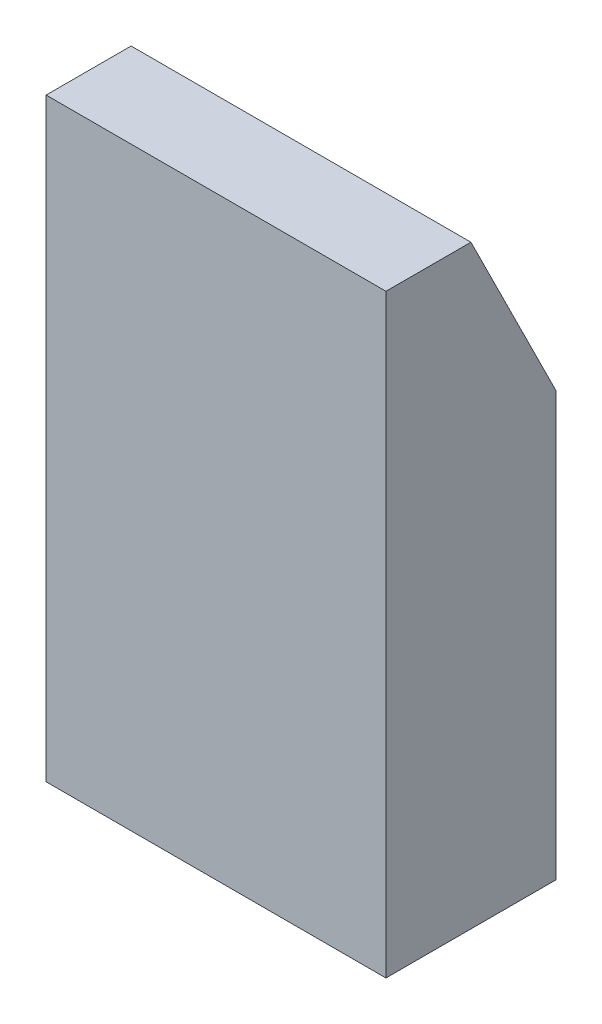
ISO-10303-21;
HEADER;
FILE_DESCRIPTION(('STEP AP214'),'2;1');
FILE_NAME('part.step','',(''),(''),'','','');
FILE_SCHEMA(('AUTOMOTIVE_DESIGN { 1 0 10303 214 1 1 1 1 }'));
ENDSEC;
DATA;
#1=APPLICATION_CONTEXT('core data for automotive mechanical design processes');
#2=APPLICATION_PROTOCOL_DEFINITION('international standard','automotive_design',2000,#1);
#3=PRODUCT_CONTEXT('',#1,'mechanical');
#4=PRODUCT('Part','Part','',(#3));
#5=PRODUCT_RELATED_PRODUCT_CATEGORY('part','',(#4));
#6=PRODUCT_DEFINITION_FORMATION('','',#4);
#7=PRODUCT_DEFINITION_CONTEXT('part definition',#1,'design');
#8=PRODUCT_DEFINITION('design','',#6,#7);
#9=PRODUCT_DEFINITION_SHAPE('','',#8);
#10=(LENGTH_UNIT() NAMED_UNIT(*) SI_UNIT(.MILLI.,.METRE.));
#11=(NAMED_UNIT(*) PLANE_ANGLE_UNIT() SI_UNIT($,.RADIAN.));
#12=(NAMED_UNIT(*) SI_UNIT($,.STERADIAN.) SOLID_ANGLE_UNIT());
#13=UNCERTAINTY_MEASURE_WITH_UNIT(LENGTH_MEASURE(1.E-05),#10,'distance_accuracy_value','');
#14=(GEOMETRIC_REPRESENTATION_CONTEXT(3) GLOBAL_UNCERTAINTY_ASSIGNED_CONTEXT((#13)) GLOBAL_UNIT_ASSIGNED_CONTEXT((#10,
#11,#12)) REPRESENTATION_CONTEXT('',''));
#15=CARTESIAN_POINT('',(0.,0.,0.));
#16=DIRECTION('',(0.,0.,1.));
#17=DIRECTION('',(1.,0.,0.));
#18=AXIS2_PLACEMENT_3D('',#15,#16,#17);
#19=CARTESIAN_POINT('',(0.,70.,-20.));
#20=DIRECTION('',(1.,0.,0.));
#21=DIRECTION('',(0.,0.,-1.));
#22=AXIS2_PLACEMENT_3D('',#19,#20,#21);
#23=PLANE('',#22);
#24=DIRECTION('',(0.,-0.895386869608943,-0.44528906760878));
#25=VECTOR('',#24,1.);
#26=CARTESIAN_POINT('',(0.,70.,-10.));
#27=LINE('',#26,#25);
#28=CARTESIAN_POINT('',(0.,70.,-10.));
#29=VERTEX_POINT('',#28);
#30=CARTESIAN_POINT('',(0.,49.8920087030835,-20.));
#31=VERTEX_POINT('',#30);
#32=EDGE_CURVE('E60',#29,#31,#27,.T.);
#33=ORIENTED_EDGE('',*,*,#32,.T.);
#34=DIRECTION('',(0.,-1.,0.));
#35=VECTOR('',#34,1.);
#36=CARTESIAN_POINT('',(0.,70.,-20.));
#37=LINE('',#36,#35);
#38=CARTESIAN_POINT('',(0.,0.,-20.));
#39=VERTEX_POINT('',#38);
#40=EDGE_CURVE('E88',#31,#39,#37,.T.);
#41=ORIENTED_EDGE('',*,*,#40,.T.);
#42=DIRECTION('',(0.,0.,1.));
#43=VECTOR('',#42,1.);
#44=CARTESIAN_POINT('',(0.,0.,-20.));
#45=LINE('',#44,#43);
#46=CARTESIAN_POINT('',(0.,0.,0.));
#47=VERTEX_POINT('',#46);
#48=EDGE_CURVE('E92',#39,#47,#45,.T.);
#49=ORIENTED_EDGE('',*,*,#48,.T.);
#50=DIRECTION('',(0.,-1.,0.));
#51=VECTOR('',#50,1.);
#52=CARTESIAN_POINT('',(0.,70.,0.));
#53=LINE('',#52,#51);
#54=CARTESIAN_POINT('',(0.,70.,0.));
#55=VERTEX_POINT('',#54);
#56=EDGE_CURVE('E11',#55,#47,#53,.T.);
#57=ORIENTED_EDGE('',*,*,#56,.F.);
#58=DIRECTION('',(0.,0.,1.));
#59=VECTOR('',#58,1.);
#60=CARTESIAN_POINT('',(0.,70.,-20.));
#61=LINE('',#60,#59);
#62=EDGE_CURVE('E109',#29,#55,#61,.T.);
#63=ORIENTED_EDGE('',*,*,#62,.F.);
#64=EDGE_LOOP('',(#33,#41,#49,#57,#63));
#65=FACE_BOUND('',#64,.T.);
#66=ADVANCED_FACE('F45',(#65),#23,.F.);
#67=CARTESIAN_POINT('',(40.,70.,0.));
#68=DIRECTION('',(-1.,0.,0.));
#69=DIRECTION('',(0.,0.,1.));
#70=AXIS2_PLACEMENT_3D('',#67,#68,#69);
#71=PLANE('',#70);
#72=DIRECTION('',(0.,-0.895386869608943,-0.44528906760878));
#73=VECTOR('',#72,1.);
#74=CARTESIAN_POINT('',(40.,70.,-10.));
#75=LINE('',#74,#73);
#76=CARTESIAN_POINT('',(40.,70.,-10.));
#77=VERTEX_POINT('',#76);
#78=CARTESIAN_POINT('',(40.,49.8920087030835,-20.));
#79=VERTEX_POINT('',#78);
#80=EDGE_CURVE('E142',#77,#79,#75,.T.);
#81=ORIENTED_EDGE('',*,*,#80,.F.);
#82=DIRECTION('',(0.,0.,-1.));
#83=VECTOR('',#82,1.);
#84=CARTESIAN_POINT('',(40.,70.,0.));
#85=LINE('',#84,#83);
#86=CARTESIAN_POINT('',(40.,70.,0.));
#87=VERTEX_POINT('',#86);
#88=EDGE_CURVE('E99',#87,#77,#85,.T.);
#89=ORIENTED_EDGE('',*,*,#88,.F.);
#90=DIRECTION('',(0.,-1.,0.));
#91=VECTOR('',#90,1.);
#92=CARTESIAN_POINT('',(40.,70.,0.));
#93=LINE('',#92,#91);
#94=CARTESIAN_POINT('',(40.,0.,0.));
#95=VERTEX_POINT('',#94);
#96=EDGE_CURVE('E53',#87,#95,#93,.T.);
#97=ORIENTED_EDGE('',*,*,#96,.T.);
#98=DIRECTION('',(0.,0.,-1.));
#99=VECTOR('',#98,1.);
#100=CARTESIAN_POINT('',(40.,0.,0.));
#101=LINE('',#100,#99);
#102=CARTESIAN_POINT('',(40.,0.,-20.));
#103=VERTEX_POINT('',#102);
#104=EDGE_CURVE('E110',#95,#103,#101,.T.);
#105=ORIENTED_EDGE('',*,*,#104,.T.);
#106=DIRECTION('',(0.,-1.,0.));
#107=VECTOR('',#106,1.);
#108=CARTESIAN_POINT('',(40.,70.,-20.));
#109=LINE('',#108,#107);
#110=EDGE_CURVE('E98',#79,#103,#109,.T.);
#111=ORIENTED_EDGE('',*,*,#110,.F.);
#112=EDGE_LOOP('',(#81,#89,#97,#105,#111));
#113=FACE_BOUND('',#112,.T.);
#114=ADVANCED_FACE('F133',(#113),#71,.F.);
#115=CARTESIAN_POINT('',(40.,70.,-20.));
#116=DIRECTION('',(0.,0.,1.));
#117=DIRECTION('',(1.,0.,0.));
#118=AXIS2_PLACEMENT_3D('',#115,#116,#117);
#119=PLANE('',#118);
#120=DIRECTION('',(-1.,0.,0.));
#121=VECTOR('',#120,1.);
#122=CARTESIAN_POINT('',(40.,49.8920087030835,-20.));
#123=LINE('',#122,#121);
#124=EDGE_CURVE('E120',#79,#31,#123,.T.);
#125=ORIENTED_EDGE('',*,*,#124,.F.);
#126=ORIENTED_EDGE('',*,*,#110,.T.);
#127=DIRECTION('',(-1.,0.,0.));
#128=VECTOR('',#127,1.);
#129=CARTESIAN_POINT('',(40.,0.,-20.));
#130=LINE('',#129,#128);
#131=EDGE_CURVE('E102',#103,#39,#130,.T.);
#132=ORIENTED_EDGE('',*,*,#131,.T.);
#133=ORIENTED_EDGE('',*,*,#40,.F.);
#134=EDGE_LOOP('',(#125,#126,#132,#133));
#135=FACE_BOUND('',#134,.T.);
#136=ADVANCED_FACE('F103',(#135),#119,.F.);
#137=CARTESIAN_POINT('',(0.,70.,0.));
#138=DIRECTION('',(0.,1.,0.));
#139=DIRECTION('',(0.,0.,1.));
#140=AXIS2_PLACEMENT_3D('',#137,#138,#139);
#141=PLANE('',#140);
#142=ORIENTED_EDGE('',*,*,#88,.T.);
#143=DIRECTION('',(-1.,0.,0.));
#144=VECTOR('',#143,1.);
#145=CARTESIAN_POINT('',(40.,70.,-10.));
#146=LINE('',#145,#144);
#147=EDGE_CURVE('E115',#77,#29,#146,.T.);
#148=ORIENTED_EDGE('',*,*,#147,.T.);
#149=ORIENTED_EDGE('',*,*,#62,.T.);
#150=DIRECTION('',(1.,0.,0.));
#151=VECTOR('',#150,1.);
#152=CARTESIAN_POINT('',(0.,70.,0.));
#153=LINE('',#152,#151);
#154=EDGE_CURVE('E69',#55,#87,#153,.T.);
#155=ORIENTED_EDGE('',*,*,#154,.T.);
#156=EDGE_LOOP('',(#142,#148,#149,#155));
#157=FACE_BOUND('',#156,.T.);
#158=ADVANCED_FACE('F151',(#157),#141,.T.);
#159=CARTESIAN_POINT('',(0.,70.,0.));
#160=DIRECTION('',(0.,0.,-1.));
#161=DIRECTION('',(-1.,0.,0.));
#162=AXIS2_PLACEMENT_3D('',#159,#160,#161);
#163=PLANE('',#162);
#164=DIRECTION('',(1.,0.,0.));
#165=VECTOR('',#164,1.);
#166=CARTESIAN_POINT('',(0.,0.,0.));
#167=LINE('',#166,#165);
#168=EDGE_CURVE('E113',#47,#95,#167,.T.);
#169=ORIENTED_EDGE('',*,*,#168,.T.);
#170=ORIENTED_EDGE('',*,*,#96,.F.);
#171=ORIENTED_EDGE('',*,*,#154,.F.);
#172=ORIENTED_EDGE('',*,*,#56,.T.);
#173=EDGE_LOOP('',(#169,#170,#171,#172));
#174=FACE_BOUND('',#173,.T.);
#175=ADVANCED_FACE('F135',(#174),#163,.F.);
#176=CARTESIAN_POINT('',(0.,0.,0.));
#177=DIRECTION('',(0.,1.,0.));
#178=DIRECTION('',(0.,0.,1.));
#179=AXIS2_PLACEMENT_3D('',#176,#177,#178);
#180=PLANE('',#179);
#181=ORIENTED_EDGE('',*,*,#48,.F.);
#182=ORIENTED_EDGE('',*,*,#131,.F.);
#183=ORIENTED_EDGE('',*,*,#104,.F.);
#184=ORIENTED_EDGE('',*,*,#168,.F.);
#185=EDGE_LOOP('',(#181,#182,#183,#184));
#186=FACE_BOUND('',#185,.T.);
#187=ADVANCED_FACE('F112',(#186),#180,.F.);
#188=CARTESIAN_POINT('',(40.,70.,-10.));
#189=DIRECTION('',(0.,0.445289067608781,-0.895386869608943));
#190=DIRECTION('',(0.,0.895386869608943,0.445289067608781));
#191=AXIS2_PLACEMENT_3D('',#188,#189,#190);
#192=PLANE('',#191);
#193=ORIENTED_EDGE('',*,*,#32,.F.);
#194=ORIENTED_EDGE('',*,*,#147,.F.);
#195=ORIENTED_EDGE('',*,*,#80,.T.);
#196=ORIENTED_EDGE('',*,*,#124,.T.);
#197=EDGE_LOOP('',(#193,#194,#195,#196));
#198=FACE_BOUND('',#197,.T.);
#199=ADVANCED_FACE('F147',(#198),#192,.T.);
#200=CLOSED_SHELL('',(#66,#114,#136,#158,#175,#187,#199));
#201=MANIFOLD_SOLID_BREP('B2',#200);
#202=ADVANCED_BREP_SHAPE_REPRESENTATION('',(#18,#201),#14);
#203=SHAPE_DEFINITION_REPRESENTATION(#9,#202);
ENDSEC;
END-ISO-10303-21;
